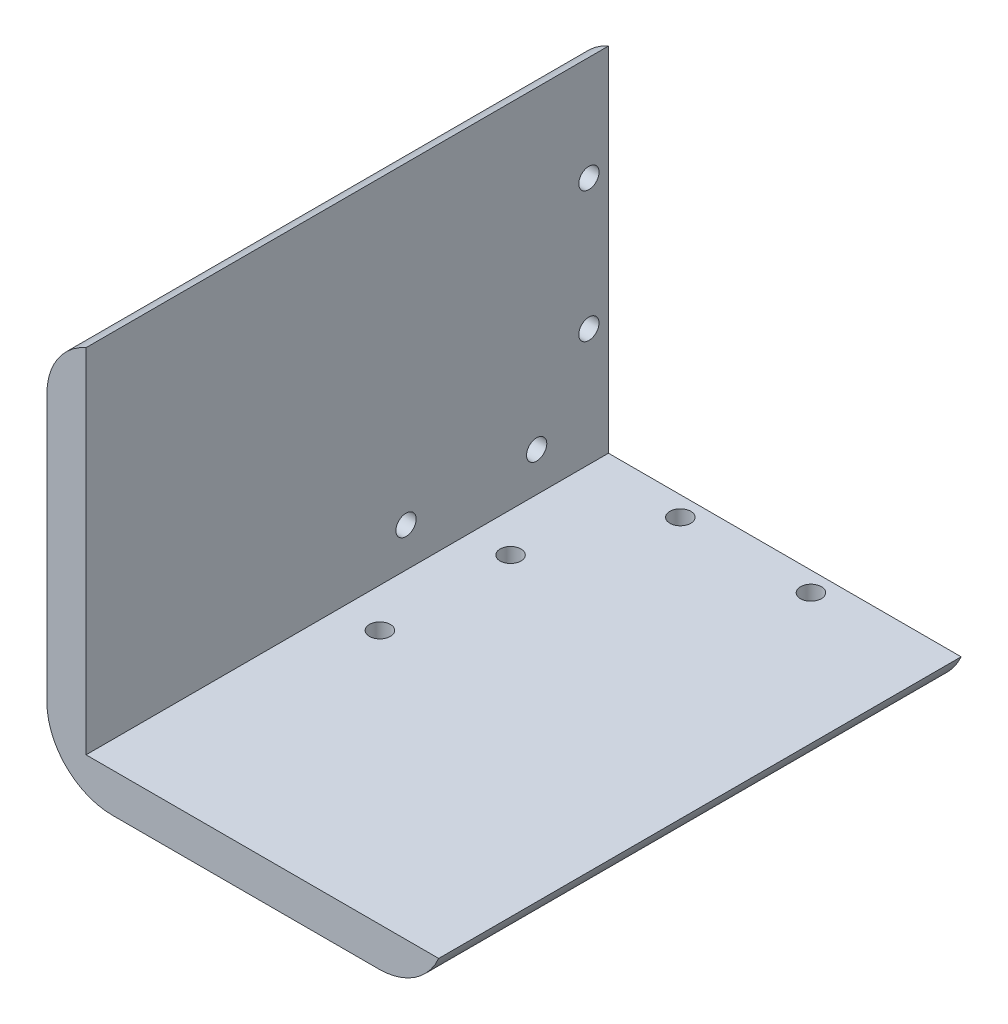
ISO-10303-21;
HEADER;
FILE_DESCRIPTION(('STEP AP214'),'2;1');
FILE_NAME('part.step','',(''),(''),'','','');
FILE_SCHEMA(('AUTOMOTIVE_DESIGN { 1 0 10303 214 1 1 1 1 }'));
ENDSEC;
DATA;
#1=APPLICATION_CONTEXT('core data for automotive mechanical design processes');
#2=APPLICATION_PROTOCOL_DEFINITION('international standard','automotive_design',2000,#1);
#3=PRODUCT_CONTEXT('',#1,'mechanical');
#4=PRODUCT('Part','Part','',(#3));
#5=PRODUCT_RELATED_PRODUCT_CATEGORY('part','',(#4));
#6=PRODUCT_DEFINITION_FORMATION('','',#4);
#7=PRODUCT_DEFINITION_CONTEXT('part definition',#1,'design');
#8=PRODUCT_DEFINITION('design','',#6,#7);
#9=PRODUCT_DEFINITION_SHAPE('','',#8);
#10=(LENGTH_UNIT() NAMED_UNIT(*) SI_UNIT(.MILLI.,.METRE.));
#11=(NAMED_UNIT(*) PLANE_ANGLE_UNIT() SI_UNIT($,.RADIAN.));
#12=(NAMED_UNIT(*) SI_UNIT($,.STERADIAN.) SOLID_ANGLE_UNIT());
#13=UNCERTAINTY_MEASURE_WITH_UNIT(LENGTH_MEASURE(1.E-05),#10,'distance_accuracy_value','');
#14=(GEOMETRIC_REPRESENTATION_CONTEXT(3) GLOBAL_UNCERTAINTY_ASSIGNED_CONTEXT((#13)) GLOBAL_UNIT_ASSIGNED_CONTEXT((#10,
#11,#12)) REPRESENTATION_CONTEXT('',''));
#15=CARTESIAN_POINT('',(0.,0.,0.));
#16=DIRECTION('',(0.,0.,1.));
#17=DIRECTION('',(1.,0.,0.));
#18=AXIS2_PLACEMENT_3D('',#15,#16,#17);
#19=CARTESIAN_POINT('',(60.,0.,40.));
#20=DIRECTION('',(0.,1.,0.));
#21=DIRECTION('',(-1.,0.,0.));
#22=AXIS2_PLACEMENT_3D('',#19,#20,#21);
#23=PLANE('',#22);
#24=CARTESIAN_POINT('',(20.,0.,-37.));
#25=DIRECTION('',(0.,-1.,0.));
#26=DIRECTION('',(1.,0.,0.));
#27=AXIS2_PLACEMENT_3D('',#24,#25,#26);
#28=CIRCLE('',#27,1.6);
#29=CARTESIAN_POINT('',(21.6,0.,-37.));
#30=VERTEX_POINT('',#29);
#31=EDGE_CURVE('E142',#30,#30,#28,.T.);
#32=ORIENTED_EDGE('',*,*,#31,.F.);
#33=EDGE_LOOP('',(#32));
#34=FACE_BOUND('',#33,.T.);
#35=CARTESIAN_POINT('',(40.,0.,-37.));
#36=DIRECTION('',(0.,-1.,0.));
#37=DIRECTION('',(1.,0.,0.));
#38=AXIS2_PLACEMENT_3D('',#35,#36,#37);
#39=CIRCLE('',#38,1.60000000000001);
#40=CARTESIAN_POINT('',(41.6,0.,-37.));
#41=VERTEX_POINT('',#40);
#42=EDGE_CURVE('E146',#41,#41,#39,.T.);
#43=ORIENTED_EDGE('',*,*,#42,.F.);
#44=EDGE_LOOP('',(#43));
#45=FACE_BOUND('',#44,.T.);
#46=CARTESIAN_POINT('',(12.0000000000001,0.,0.99999999999999));
#47=DIRECTION('',(0.,1.,0.));
#48=DIRECTION('',(0.,0.,1.));
#49=AXIS2_PLACEMENT_3D('',#46,#47,#48);
#50=CIRCLE('',#49,1.6);
#51=CARTESIAN_POINT('',(12.0000000000001,0.,2.59999999999999));
#52=VERTEX_POINT('',#51);
#53=EDGE_CURVE('E154',#52,#52,#50,.T.);
#54=ORIENTED_EDGE('',*,*,#53,.T.);
#55=EDGE_LOOP('',(#54));
#56=FACE_BOUND('',#55,.T.);
#57=CARTESIAN_POINT('',(12.0000000000001,0.,-19.));
#58=DIRECTION('',(0.,1.,0.));
#59=DIRECTION('',(0.,0.,1.));
#60=AXIS2_PLACEMENT_3D('',#57,#58,#59);
#61=CIRCLE('',#60,1.6);
#62=CARTESIAN_POINT('',(12.0000000000001,0.,-17.4));
#63=VERTEX_POINT('',#62);
#64=EDGE_CURVE('E148',#63,#63,#61,.T.);
#65=ORIENTED_EDGE('',*,*,#64,.T.);
#66=EDGE_LOOP('',(#65));
#67=FACE_BOUND('',#66,.T.);
#68=DIRECTION('',(1.,0.,0.));
#69=VECTOR('',#68,1.);
#70=CARTESIAN_POINT('',(60.,0.,-40.));
#71=LINE('',#70,#69);
#72=CARTESIAN_POINT('',(10.,0.,-40.));
#73=VERTEX_POINT('',#72);
#74=CARTESIAN_POINT('',(50.8348486100883,0.,-40.));
#75=VERTEX_POINT('',#74);
#76=EDGE_CURVE('E186',#73,#75,#71,.T.);
#77=ORIENTED_EDGE('',*,*,#76,.T.);
#78=DIRECTION('',(0.,0.,1.));
#79=VECTOR('',#78,1.);
#80=CARTESIAN_POINT('',(50.8348486100883,0.,40.));
#81=LINE('',#80,#79);
#82=CARTESIAN_POINT('',(50.8348486100883,0.,40.));
#83=VERTEX_POINT('',#82);
#84=EDGE_CURVE('E11',#75,#83,#81,.T.);
#85=ORIENTED_EDGE('',*,*,#84,.T.);
#86=DIRECTION('',(1.,0.,0.));
#87=VECTOR('',#86,1.);
#88=CARTESIAN_POINT('',(60.,0.,40.));
#89=LINE('',#88,#87);
#90=CARTESIAN_POINT('',(10.,0.,40.));
#91=VERTEX_POINT('',#90);
#92=EDGE_CURVE('E104',#91,#83,#89,.T.);
#93=ORIENTED_EDGE('',*,*,#92,.F.);
#94=DIRECTION('',(0.,0.,-1.));
#95=VECTOR('',#94,1.);
#96=CARTESIAN_POINT('',(10.,0.,40.));
#97=LINE('',#96,#95);
#98=EDGE_CURVE('E49',#91,#73,#97,.T.);
#99=ORIENTED_EDGE('',*,*,#98,.T.);
#100=EDGE_LOOP('',(#77,#85,#93,#99));
#101=FACE_BOUND('',#100,.T.);
#102=ADVANCED_FACE('F41',(#34,#45,#56,#67,#101),#23,.F.);
#103=CARTESIAN_POINT('',(6.00000000000001,6.,40.));
#104=DIRECTION('',(0.,-1.,0.));
#105=DIRECTION('',(0.,0.,-1.));
#106=AXIS2_PLACEMENT_3D('',#103,#104,#105);
#107=PLANE('',#106);
#108=CARTESIAN_POINT('',(20.,6.,-37.));
#109=DIRECTION('',(0.,-1.,0.));
#110=DIRECTION('',(0.,0.,-1.));
#111=AXIS2_PLACEMENT_3D('',#108,#109,#110);
#112=CIRCLE('',#111,1.6);
#113=CARTESIAN_POINT('',(20.,6.,-38.6));
#114=VERTEX_POINT('',#113);
#115=EDGE_CURVE('E44',#114,#114,#112,.T.);
#116=ORIENTED_EDGE('',*,*,#115,.T.);
#117=EDGE_LOOP('',(#116));
#118=FACE_BOUND('',#117,.T.);
#119=CARTESIAN_POINT('',(40.,6.,-37.));
#120=DIRECTION('',(0.,-1.,0.));
#121=DIRECTION('',(0.,0.,-1.));
#122=AXIS2_PLACEMENT_3D('',#119,#120,#121);
#123=CIRCLE('',#122,1.60000000000001);
#124=CARTESIAN_POINT('',(40.,6.,-38.6));
#125=VERTEX_POINT('',#124);
#126=EDGE_CURVE('E138',#125,#125,#123,.T.);
#127=ORIENTED_EDGE('',*,*,#126,.T.);
#128=EDGE_LOOP('',(#127));
#129=FACE_BOUND('',#128,.T.);
#130=CARTESIAN_POINT('',(12.0000000000001,6.,0.99999999999999));
#131=DIRECTION('',(0.,1.,0.));
#132=DIRECTION('',(0.,0.,1.));
#133=AXIS2_PLACEMENT_3D('',#130,#131,#132);
#134=CIRCLE('',#133,1.6);
#135=CARTESIAN_POINT('',(12.0000000000001,6.,2.59999999999999));
#136=VERTEX_POINT('',#135);
#137=EDGE_CURVE('E157',#136,#136,#134,.T.);
#138=ORIENTED_EDGE('',*,*,#137,.F.);
#139=EDGE_LOOP('',(#138));
#140=FACE_BOUND('',#139,.T.);
#141=CARTESIAN_POINT('',(12.0000000000001,6.,-19.));
#142=DIRECTION('',(0.,1.,0.));
#143=DIRECTION('',(0.,0.,1.));
#144=AXIS2_PLACEMENT_3D('',#141,#142,#143);
#145=CIRCLE('',#144,1.6);
#146=CARTESIAN_POINT('',(12.0000000000001,6.,-17.4));
#147=VERTEX_POINT('',#146);
#148=EDGE_CURVE('E165',#147,#147,#145,.T.);
#149=ORIENTED_EDGE('',*,*,#148,.F.);
#150=EDGE_LOOP('',(#149));
#151=FACE_BOUND('',#150,.T.);
#152=DIRECTION('',(-1.,0.,0.));
#153=VECTOR('',#152,1.);
#154=CARTESIAN_POINT('',(6.00000000000001,6.,-40.));
#155=LINE('',#154,#153);
#156=CARTESIAN_POINT('',(60.,6.,-40.));
#157=VERTEX_POINT('',#156);
#158=CARTESIAN_POINT('',(6.00000000000001,6.,-40.));
#159=VERTEX_POINT('',#158);
#160=EDGE_CURVE('E197',#157,#159,#155,.T.);
#161=ORIENTED_EDGE('',*,*,#160,.T.);
#162=DIRECTION('',(0.,0.,-1.));
#163=VECTOR('',#162,1.);
#164=CARTESIAN_POINT('',(6.00000000000001,6.,40.));
#165=LINE('',#164,#163);
#166=CARTESIAN_POINT('',(6.00000000000001,6.,40.));
#167=VERTEX_POINT('',#166);
#168=EDGE_CURVE('E117',#167,#159,#165,.T.);
#169=ORIENTED_EDGE('',*,*,#168,.F.);
#170=DIRECTION('',(-1.,0.,0.));
#171=VECTOR('',#170,1.);
#172=CARTESIAN_POINT('',(6.00000000000001,6.,40.));
#173=LINE('',#172,#171);
#174=CARTESIAN_POINT('',(60.,6.,40.));
#175=VERTEX_POINT('',#174);
#176=EDGE_CURVE('E103',#175,#167,#173,.T.);
#177=ORIENTED_EDGE('',*,*,#176,.F.);
#178=DIRECTION('',(0.,0.,-1.));
#179=VECTOR('',#178,1.);
#180=CARTESIAN_POINT('',(60.,6.,40.));
#181=LINE('',#180,#179);
#182=EDGE_CURVE('E114',#175,#157,#181,.T.);
#183=ORIENTED_EDGE('',*,*,#182,.T.);
#184=EDGE_LOOP('',(#161,#169,#177,#183));
#185=FACE_BOUND('',#184,.T.);
#186=ADVANCED_FACE('F115',(#118,#129,#140,#151,#185),#107,.F.);
#187=CARTESIAN_POINT('',(6.,60.,40.));
#188=DIRECTION('',(-1.,0.,0.));
#189=DIRECTION('',(0.,-1.,0.));
#190=AXIS2_PLACEMENT_3D('',#187,#188,#189);
#191=PLANE('',#190);
#192=CARTESIAN_POINT('',(6.00000000000001,11.9999999999996,-9.00000000000001));
#193=DIRECTION('',(-1.,0.,0.));
#194=DIRECTION('',(0.,-1.,0.));
#195=AXIS2_PLACEMENT_3D('',#192,#193,#194);
#196=CIRCLE('',#195,1.55);
#197=CARTESIAN_POINT('',(6.00000000000001,11.9999999999996,-7.45000000000001));
#198=VERTEX_POINT('',#197);
#199=EDGE_CURVE('E190',#198,#198,#196,.T.);
#200=ORIENTED_EDGE('',*,*,#199,.T.);
#201=EDGE_LOOP('',(#200));
#202=FACE_BOUND('',#201,.T.);
#203=CARTESIAN_POINT('',(6.00000000000001,11.9999999999996,-29.));
#204=DIRECTION('',(-1.,0.,0.));
#205=DIRECTION('',(0.,-1.,0.));
#206=AXIS2_PLACEMENT_3D('',#203,#204,#205);
#207=CIRCLE('',#206,1.55);
#208=CARTESIAN_POINT('',(6.00000000000001,11.9999999999996,-27.45));
#209=VERTEX_POINT('',#208);
#210=EDGE_CURVE('E184',#209,#209,#207,.T.);
#211=ORIENTED_EDGE('',*,*,#210,.T.);
#212=EDGE_LOOP('',(#211));
#213=FACE_BOUND('',#212,.T.);
#214=CARTESIAN_POINT('',(6.,43.9999999999997,-37.));
#215=DIRECTION('',(-1.,0.,0.));
#216=DIRECTION('',(0.,-1.,0.));
#217=AXIS2_PLACEMENT_3D('',#214,#215,#216);
#218=CIRCLE('',#217,1.55);
#219=CARTESIAN_POINT('',(6.00000000000001,43.9999999999997,-35.45));
#220=VERTEX_POINT('',#219);
#221=EDGE_CURVE('E182',#220,#220,#218,.T.);
#222=ORIENTED_EDGE('',*,*,#221,.T.);
#223=EDGE_LOOP('',(#222));
#224=FACE_BOUND('',#223,.T.);
#225=CARTESIAN_POINT('',(6.00000000000001,23.9999999999997,-37.));
#226=DIRECTION('',(-1.,0.,0.));
#227=DIRECTION('',(0.,-1.,0.));
#228=AXIS2_PLACEMENT_3D('',#225,#226,#227);
#229=CIRCLE('',#228,1.55);
#230=CARTESIAN_POINT('',(6.00000000000001,23.9999999999997,-35.45));
#231=VERTEX_POINT('',#230);
#232=EDGE_CURVE('E179',#231,#231,#229,.T.);
#233=ORIENTED_EDGE('',*,*,#232,.T.);
#234=EDGE_LOOP('',(#233));
#235=FACE_BOUND('',#234,.T.);
#236=DIRECTION('',(0.,1.,0.));
#237=VECTOR('',#236,1.);
#238=CARTESIAN_POINT('',(6.,60.,-40.));
#239=LINE('',#238,#237);
#240=CARTESIAN_POINT('',(6.,60.,-40.));
#241=VERTEX_POINT('',#240);
#242=EDGE_CURVE('E200',#159,#241,#239,.T.);
#243=ORIENTED_EDGE('',*,*,#242,.T.);
#244=DIRECTION('',(0.,0.,-1.));
#245=VECTOR('',#244,1.);
#246=CARTESIAN_POINT('',(6.,60.,40.));
#247=LINE('',#246,#245);
#248=CARTESIAN_POINT('',(6.,60.,40.));
#249=VERTEX_POINT('',#248);
#250=EDGE_CURVE('E127',#249,#241,#247,.T.);
#251=ORIENTED_EDGE('',*,*,#250,.F.);
#252=DIRECTION('',(0.,1.,0.));
#253=VECTOR('',#252,1.);
#254=CARTESIAN_POINT('',(6.,60.,40.));
#255=LINE('',#254,#253);
#256=EDGE_CURVE('E118',#167,#249,#255,.T.);
#257=ORIENTED_EDGE('',*,*,#256,.F.);
#258=ORIENTED_EDGE('',*,*,#168,.T.);
#259=EDGE_LOOP('',(#243,#251,#257,#258));
#260=FACE_BOUND('',#259,.T.);
#261=ADVANCED_FACE('F209',(#202,#213,#224,#235,#260),#191,.F.);
#262=CARTESIAN_POINT('',(0.,0.,40.));
#263=DIRECTION('',(1.,0.,0.));
#264=DIRECTION('',(0.,0.,-1.));
#265=AXIS2_PLACEMENT_3D('',#262,#263,#264);
#266=PLANE('',#265);
#267=CARTESIAN_POINT('',(0.,11.9999999999996,-9.00000000000001));
#268=DIRECTION('',(-1.,0.,0.));
#269=DIRECTION('',(0.,0.,1.));
#270=AXIS2_PLACEMENT_3D('',#267,#268,#269);
#271=CIRCLE('',#270,1.55);
#272=CARTESIAN_POINT('',(0.,11.9999999999996,-7.45000000000001));
#273=VERTEX_POINT('',#272);
#274=EDGE_CURVE('E158',#273,#273,#271,.T.);
#275=ORIENTED_EDGE('',*,*,#274,.F.);
#276=EDGE_LOOP('',(#275));
#277=FACE_BOUND('',#276,.T.);
#278=CARTESIAN_POINT('',(0.,11.9999999999996,-29.));
#279=DIRECTION('',(-1.,0.,0.));
#280=DIRECTION('',(0.,0.,1.));
#281=AXIS2_PLACEMENT_3D('',#278,#279,#280);
#282=CIRCLE('',#281,1.55);
#283=CARTESIAN_POINT('',(0.,11.9999999999996,-27.45));
#284=VERTEX_POINT('',#283);
#285=EDGE_CURVE('E172',#284,#284,#282,.T.);
#286=ORIENTED_EDGE('',*,*,#285,.F.);
#287=EDGE_LOOP('',(#286));
#288=FACE_BOUND('',#287,.T.);
#289=CARTESIAN_POINT('',(0.,43.9999999999997,-37.));
#290=DIRECTION('',(-1.,0.,0.));
#291=DIRECTION('',(0.,0.,1.));
#292=AXIS2_PLACEMENT_3D('',#289,#290,#291);
#293=CIRCLE('',#292,1.55);
#294=CARTESIAN_POINT('',(0.,43.9999999999997,-35.45));
#295=VERTEX_POINT('',#294);
#296=EDGE_CURVE('E170',#295,#295,#293,.T.);
#297=ORIENTED_EDGE('',*,*,#296,.F.);
#298=EDGE_LOOP('',(#297));
#299=FACE_BOUND('',#298,.T.);
#300=CARTESIAN_POINT('',(0.,23.9999999999997,-37.));
#301=DIRECTION('',(-1.,0.,0.));
#302=DIRECTION('',(0.,0.,1.));
#303=AXIS2_PLACEMENT_3D('',#300,#301,#302);
#304=CIRCLE('',#303,1.55);
#305=CARTESIAN_POINT('',(0.,23.9999999999997,-35.45));
#306=VERTEX_POINT('',#305);
#307=EDGE_CURVE('E168',#306,#306,#304,.T.);
#308=ORIENTED_EDGE('',*,*,#307,.F.);
#309=EDGE_LOOP('',(#308));
#310=FACE_BOUND('',#309,.T.);
#311=DIRECTION('',(0.,-1.,0.));
#312=VECTOR('',#311,1.);
#313=CARTESIAN_POINT('',(0.,0.,40.));
#314=LINE('',#313,#312);
#315=CARTESIAN_POINT('',(0.,50.8348486100883,40.));
#316=VERTEX_POINT('',#315);
#317=CARTESIAN_POINT('',(0.,10.,40.));
#318=VERTEX_POINT('',#317);
#319=EDGE_CURVE('E191',#316,#318,#314,.T.);
#320=ORIENTED_EDGE('',*,*,#319,.F.);
#321=DIRECTION('',(0.,0.,-1.));
#322=VECTOR('',#321,1.);
#323=CARTESIAN_POINT('',(0.,50.8348486100883,40.));
#324=LINE('',#323,#322);
#325=CARTESIAN_POINT('',(0.,50.8348486100883,-40.));
#326=VERTEX_POINT('',#325);
#327=EDGE_CURVE('E121',#316,#326,#324,.T.);
#328=ORIENTED_EDGE('',*,*,#327,.T.);
#329=DIRECTION('',(0.,-1.,0.));
#330=VECTOR('',#329,1.);
#331=CARTESIAN_POINT('',(0.,0.,-40.));
#332=LINE('',#331,#330);
#333=CARTESIAN_POINT('',(0.,10.,-40.));
#334=VERTEX_POINT('',#333);
#335=EDGE_CURVE('E192',#326,#334,#332,.T.);
#336=ORIENTED_EDGE('',*,*,#335,.T.);
#337=DIRECTION('',(0.,0.,-1.));
#338=VECTOR('',#337,1.);
#339=CARTESIAN_POINT('',(0.,10.,40.));
#340=LINE('',#339,#338);
#341=EDGE_CURVE('E125',#334,#318,#340,.F.);
#342=ORIENTED_EDGE('',*,*,#341,.T.);
#343=EDGE_LOOP('',(#320,#328,#336,#342));
#344=FACE_BOUND('',#343,.T.);
#345=ADVANCED_FACE('F218',(#277,#288,#299,#310,#344),#266,.F.);
#346=CARTESIAN_POINT('',(0.,0.,40.));
#347=DIRECTION('',(0.,0.,-1.));
#348=DIRECTION('',(-1.,0.,0.));
#349=AXIS2_PLACEMENT_3D('',#346,#347,#348);
#350=PLANE('',#349);
#351=ORIENTED_EDGE('',*,*,#256,.T.);
#352=CARTESIAN_POINT('',(10.,50.8348486100883,40.));
#353=DIRECTION('',(0.,0.,-1.));
#354=DIRECTION('',(-1.,0.,0.));
#355=AXIS2_PLACEMENT_3D('',#352,#353,#354);
#356=CIRCLE('',#355,10.);
#357=EDGE_CURVE('E107',#249,#316,#356,.F.);
#358=ORIENTED_EDGE('',*,*,#357,.T.);
#359=ORIENTED_EDGE('',*,*,#319,.T.);
#360=CARTESIAN_POINT('',(10.,10.,40.));
#361=DIRECTION('',(0.,0.,-1.));
#362=DIRECTION('',(-1.,0.,0.));
#363=AXIS2_PLACEMENT_3D('',#360,#361,#362);
#364=CIRCLE('',#363,10.);
#365=EDGE_CURVE('E63',#318,#91,#364,.F.);
#366=ORIENTED_EDGE('',*,*,#365,.T.);
#367=ORIENTED_EDGE('',*,*,#92,.T.);
#368=CARTESIAN_POINT('',(50.8348486100883,10.,40.));
#369=DIRECTION('',(0.,0.,-1.));
#370=DIRECTION('',(-1.,0.,0.));
#371=AXIS2_PLACEMENT_3D('',#368,#369,#370);
#372=CIRCLE('',#371,10.);
#373=EDGE_CURVE('E99',#83,#175,#372,.F.);
#374=ORIENTED_EDGE('',*,*,#373,.T.);
#375=ORIENTED_EDGE('',*,*,#176,.T.);
#376=EDGE_LOOP('',(#351,#358,#359,#366,#367,#374,#375));
#377=FACE_BOUND('',#376,.T.);
#378=ADVANCED_FACE('F105',(#377),#350,.F.);
#379=CARTESIAN_POINT('',(0.,0.,-40.));
#380=DIRECTION('',(0.,0.,-1.));
#381=DIRECTION('',(-1.,0.,0.));
#382=AXIS2_PLACEMENT_3D('',#379,#380,#381);
#383=PLANE('',#382);
#384=ORIENTED_EDGE('',*,*,#335,.F.);
#385=CARTESIAN_POINT('',(10.,50.8348486100883,-40.));
#386=DIRECTION('',(0.,0.,-1.));
#387=DIRECTION('',(-1.,0.,0.));
#388=AXIS2_PLACEMENT_3D('',#385,#386,#387);
#389=CIRCLE('',#388,10.);
#390=EDGE_CURVE('E131',#326,#241,#389,.T.);
#391=ORIENTED_EDGE('',*,*,#390,.T.);
#392=ORIENTED_EDGE('',*,*,#242,.F.);
#393=ORIENTED_EDGE('',*,*,#160,.F.);
#394=CARTESIAN_POINT('',(50.8348486100883,10.,-40.));
#395=DIRECTION('',(0.,0.,-1.));
#396=DIRECTION('',(-1.,0.,0.));
#397=AXIS2_PLACEMENT_3D('',#394,#395,#396);
#398=CIRCLE('',#397,10.);
#399=EDGE_CURVE('E122',#157,#75,#398,.T.);
#400=ORIENTED_EDGE('',*,*,#399,.T.);
#401=ORIENTED_EDGE('',*,*,#76,.F.);
#402=CARTESIAN_POINT('',(10.,10.,-40.));
#403=DIRECTION('',(0.,0.,-1.));
#404=DIRECTION('',(-1.,0.,0.));
#405=AXIS2_PLACEMENT_3D('',#402,#403,#404);
#406=CIRCLE('',#405,10.);
#407=EDGE_CURVE('E135',#73,#334,#406,.T.);
#408=ORIENTED_EDGE('',*,*,#407,.T.);
#409=EDGE_LOOP('',(#384,#391,#392,#393,#400,#401,#408));
#410=FACE_BOUND('',#409,.T.);
#411=ADVANCED_FACE('F212',(#410),#383,.T.);
#412=CARTESIAN_POINT('',(10.,50.8348486100883,40.));
#413=DIRECTION('',(0.,0.,-1.));
#414=DIRECTION('',(-1.,0.,0.));
#415=AXIS2_PLACEMENT_3D('',#412,#413,#414);
#416=CYLINDRICAL_SURFACE('',#415,10.);
#417=ORIENTED_EDGE('',*,*,#357,.F.);
#418=ORIENTED_EDGE('',*,*,#250,.T.);
#419=ORIENTED_EDGE('',*,*,#390,.F.);
#420=ORIENTED_EDGE('',*,*,#327,.F.);
#421=EDGE_LOOP('',(#417,#418,#419,#420));
#422=FACE_BOUND('',#421,.T.);
#423=ADVANCED_FACE('F210',(#422),#416,.T.);
#424=CARTESIAN_POINT('',(50.8348486100883,10.,40.));
#425=DIRECTION('',(0.,0.,1.));
#426=DIRECTION('',(1.,0.,0.));
#427=AXIS2_PLACEMENT_3D('',#424,#425,#426);
#428=CYLINDRICAL_SURFACE('',#427,10.);
#429=ORIENTED_EDGE('',*,*,#373,.F.);
#430=ORIENTED_EDGE('',*,*,#84,.F.);
#431=ORIENTED_EDGE('',*,*,#399,.F.);
#432=ORIENTED_EDGE('',*,*,#182,.F.);
#433=EDGE_LOOP('',(#429,#430,#431,#432));
#434=FACE_BOUND('',#433,.T.);
#435=ADVANCED_FACE('F116',(#434),#428,.T.);
#436=CARTESIAN_POINT('',(10.,10.,40.));
#437=DIRECTION('',(0.,0.,-1.));
#438=DIRECTION('',(-1.,0.,0.));
#439=AXIS2_PLACEMENT_3D('',#436,#437,#438);
#440=CYLINDRICAL_SURFACE('',#439,10.);
#441=ORIENTED_EDGE('',*,*,#365,.F.);
#442=ORIENTED_EDGE('',*,*,#341,.F.);
#443=ORIENTED_EDGE('',*,*,#407,.F.);
#444=ORIENTED_EDGE('',*,*,#98,.F.);
#445=EDGE_LOOP('',(#441,#442,#443,#444));
#446=FACE_BOUND('',#445,.T.);
#447=ADVANCED_FACE('F43',(#446),#440,.T.);
#448=CARTESIAN_POINT('',(60.,23.9999999999997,-37.));
#449=DIRECTION('',(-1.,0.,0.));
#450=DIRECTION('',(0.,0.,1.));
#451=AXIS2_PLACEMENT_3D('',#448,#449,#450);
#452=CYLINDRICAL_SURFACE('',#451,1.55);
#453=CARTESIAN_POINT('',(0.,23.9999999999997,-35.45));
#454=CARTESIAN_POINT('',(0.0625000000000001,23.9999999999997,-35.45));
#455=CARTESIAN_POINT('',(0.125,23.9999999999997,-35.45));
#456=CARTESIAN_POINT('',(0.25,23.9999999999997,-35.45));
#457=CARTESIAN_POINT('',(0.3125,23.9999999999997,-35.45));
#458=CARTESIAN_POINT('',(0.4375,23.9999999999997,-35.45));
#459=CARTESIAN_POINT('',(0.5,23.9999999999997,-35.45));
#460=CARTESIAN_POINT('',(0.625000000000001,23.9999999999997,-35.45));
#461=CARTESIAN_POINT('',(0.687500000000001,23.9999999999997,-35.45));
#462=CARTESIAN_POINT('',(0.812500000000001,23.9999999999997,-35.45));
#463=CARTESIAN_POINT('',(0.875000000000001,23.9999999999997,-35.45));
#464=CARTESIAN_POINT('',(1.,23.9999999999997,-35.45));
#465=CARTESIAN_POINT('',(1.0625,23.9999999999997,-35.45));
#466=CARTESIAN_POINT('',(1.1875,23.9999999999997,-35.45));
#467=CARTESIAN_POINT('',(1.25,23.9999999999997,-35.45));
#468=CARTESIAN_POINT('',(1.375,23.9999999999997,-35.45));
#469=CARTESIAN_POINT('',(1.4375,23.9999999999997,-35.45));
#470=CARTESIAN_POINT('',(1.5625,23.9999999999997,-35.45));
#471=CARTESIAN_POINT('',(1.625,23.9999999999997,-35.45));
#472=CARTESIAN_POINT('',(1.75,23.9999999999997,-35.45));
#473=CARTESIAN_POINT('',(1.8125,23.9999999999997,-35.45));
#474=CARTESIAN_POINT('',(1.9375,23.9999999999997,-35.45));
#475=CARTESIAN_POINT('',(2.,23.9999999999997,-35.45));
#476=CARTESIAN_POINT('',(2.125,23.9999999999997,-35.45));
#477=CARTESIAN_POINT('',(2.1875,23.9999999999997,-35.45));
#478=CARTESIAN_POINT('',(2.3125,23.9999999999997,-35.45));
#479=CARTESIAN_POINT('',(2.375,23.9999999999997,-35.45));
#480=CARTESIAN_POINT('',(2.5,23.9999999999997,-35.45));
#481=CARTESIAN_POINT('',(2.5625,23.9999999999997,-35.45));
#482=CARTESIAN_POINT('',(2.6875,23.9999999999997,-35.45));
#483=CARTESIAN_POINT('',(2.75,23.9999999999997,-35.45));
#484=CARTESIAN_POINT('',(2.875,23.9999999999997,-35.45));
#485=CARTESIAN_POINT('',(2.9375,23.9999999999997,-35.45));
#486=CARTESIAN_POINT('',(3.0625,23.9999999999997,-35.45));
#487=CARTESIAN_POINT('',(3.125,23.9999999999997,-35.45));
#488=CARTESIAN_POINT('',(3.25,23.9999999999997,-35.45));
#489=CARTESIAN_POINT('',(3.3125,23.9999999999997,-35.45));
#490=CARTESIAN_POINT('',(3.4375,23.9999999999997,-35.45));
#491=CARTESIAN_POINT('',(3.5,23.9999999999997,-35.45));
#492=CARTESIAN_POINT('',(3.625,23.9999999999997,-35.45));
#493=CARTESIAN_POINT('',(3.6875,23.9999999999997,-35.45));
#494=CARTESIAN_POINT('',(3.8125,23.9999999999997,-35.45));
#495=CARTESIAN_POINT('',(3.875,23.9999999999997,-35.45));
#496=CARTESIAN_POINT('',(4.,23.9999999999997,-35.45));
#497=CARTESIAN_POINT('',(4.0625,23.9999999999997,-35.45));
#498=CARTESIAN_POINT('',(4.1875,23.9999999999997,-35.45));
#499=CARTESIAN_POINT('',(4.25,23.9999999999997,-35.45));
#500=CARTESIAN_POINT('',(4.375,23.9999999999997,-35.45));
#501=CARTESIAN_POINT('',(4.4375,23.9999999999997,-35.45));
#502=CARTESIAN_POINT('',(4.5625,23.9999999999997,-35.45));
#503=CARTESIAN_POINT('',(4.625,23.9999999999997,-35.45));
#504=CARTESIAN_POINT('',(4.75,23.9999999999997,-35.45));
#505=CARTESIAN_POINT('',(4.8125,23.9999999999997,-35.45));
#506=CARTESIAN_POINT('',(4.9375,23.9999999999997,-35.45));
#507=CARTESIAN_POINT('',(5.,23.9999999999997,-35.45));
#508=CARTESIAN_POINT('',(5.125,23.9999999999997,-35.45));
#509=CARTESIAN_POINT('',(5.1875,23.9999999999997,-35.45));
#510=CARTESIAN_POINT('',(5.3125,23.9999999999997,-35.45));
#511=CARTESIAN_POINT('',(5.375,23.9999999999997,-35.45));
#512=CARTESIAN_POINT('',(5.50000000000001,23.9999999999997,-35.45));
#513=CARTESIAN_POINT('',(5.56250000000001,23.9999999999997,-35.45));
#514=CARTESIAN_POINT('',(5.68750000000001,23.9999999999997,-35.45));
#515=CARTESIAN_POINT('',(5.75000000000001,23.9999999999997,-35.45));
#516=CARTESIAN_POINT('',(5.87500000000001,23.9999999999997,-35.45));
#517=CARTESIAN_POINT('',(5.93750000000001,23.9999999999997,-35.45));
#518=CARTESIAN_POINT('',(6.00000000000001,23.9999999999997,-35.45));
#519=B_SPLINE_CURVE_WITH_KNOTS('',3,(#453,#454,#455,#456,#457,#458,#459,#460,#461,#462,#463,
#464,#465,#466,#467,#468,#469,#470,#471,#472,#473,#474,#475,#476,#477,#478,#479,#480,#481,#482,
#483,#484,#485,#486,#487,#488,#489,#490,#491,#492,#493,#494,#495,#496,#497,#498,#499,#500,#501,
#502,#503,#504,#505,#506,#507,#508,#509,#510,#511,#512,#513,#514,#515,#516,#517,#518),
.UNSPECIFIED.,.F.,.F.,(4,2,2,2,2,2,2,2,2,2,2,2,2,2,2,2,2,2,2,2,2,2,2,2,2,2,2,2,2,2,2,2,4),(0.,
0.1875,0.375,0.5625,0.750000000000001,0.937500000000001,1.125,1.3125,1.5,1.6875,1.875,2.0625,
2.25,2.4375,2.625,2.8125,3.,3.1875,3.375,3.5625,3.75,3.9375,4.125,4.3125,4.5,4.6875,4.875,
5.0625,5.25,5.4375,5.62500000000001,5.81250000000001,6.00000000000001),.UNSPECIFIED.);
#520=EDGE_CURVE('BSEAM239',#306,#231,#519,.T.);
#521=ORIENTED_EDGE('',*,*,#307,.T.);
#522=ORIENTED_EDGE('',*,*,#232,.F.);
#523=ORIENTED_EDGE('',*,*,#520,.T.);
#524=ORIENTED_EDGE('',*,*,#520,.F.);
#525=EDGE_LOOP('',(#521,#523,#522,#524));
#526=FACE_BOUND('',#525,.T.);
#527=ADVANCED_FACE('F239',(#526),#452,.F.);
#528=CARTESIAN_POINT('',(60.,43.9999999999997,-37.));
#529=DIRECTION('',(-1.,0.,0.));
#530=DIRECTION('',(0.,0.,1.));
#531=AXIS2_PLACEMENT_3D('',#528,#529,#530);
#532=CYLINDRICAL_SURFACE('',#531,1.55);
#533=CARTESIAN_POINT('',(0.,43.9999999999997,-35.45));
#534=CARTESIAN_POINT('',(0.0625000000000001,43.9999999999997,-35.45));
#535=CARTESIAN_POINT('',(0.125,43.9999999999997,-35.45));
#536=CARTESIAN_POINT('',(0.25,43.9999999999997,-35.45));
#537=CARTESIAN_POINT('',(0.3125,43.9999999999997,-35.45));
#538=CARTESIAN_POINT('',(0.4375,43.9999999999997,-35.45));
#539=CARTESIAN_POINT('',(0.5,43.9999999999997,-35.45));
#540=CARTESIAN_POINT('',(0.625000000000001,43.9999999999997,-35.45));
#541=CARTESIAN_POINT('',(0.687500000000001,43.9999999999997,-35.45));
#542=CARTESIAN_POINT('',(0.812500000000001,43.9999999999997,-35.45));
#543=CARTESIAN_POINT('',(0.875000000000001,43.9999999999997,-35.45));
#544=CARTESIAN_POINT('',(1.,43.9999999999997,-35.45));
#545=CARTESIAN_POINT('',(1.0625,43.9999999999997,-35.45));
#546=CARTESIAN_POINT('',(1.1875,43.9999999999997,-35.45));
#547=CARTESIAN_POINT('',(1.25,43.9999999999997,-35.45));
#548=CARTESIAN_POINT('',(1.375,43.9999999999997,-35.45));
#549=CARTESIAN_POINT('',(1.4375,43.9999999999997,-35.45));
#550=CARTESIAN_POINT('',(1.5625,43.9999999999997,-35.45));
#551=CARTESIAN_POINT('',(1.625,43.9999999999997,-35.45));
#552=CARTESIAN_POINT('',(1.75,43.9999999999997,-35.45));
#553=CARTESIAN_POINT('',(1.8125,43.9999999999997,-35.45));
#554=CARTESIAN_POINT('',(1.9375,43.9999999999997,-35.45));
#555=CARTESIAN_POINT('',(2.,43.9999999999997,-35.45));
#556=CARTESIAN_POINT('',(2.125,43.9999999999997,-35.45));
#557=CARTESIAN_POINT('',(2.1875,43.9999999999997,-35.45));
#558=CARTESIAN_POINT('',(2.3125,43.9999999999997,-35.45));
#559=CARTESIAN_POINT('',(2.375,43.9999999999997,-35.45));
#560=CARTESIAN_POINT('',(2.5,43.9999999999997,-35.45));
#561=CARTESIAN_POINT('',(2.5625,43.9999999999997,-35.45));
#562=CARTESIAN_POINT('',(2.6875,43.9999999999997,-35.45));
#563=CARTESIAN_POINT('',(2.75,43.9999999999997,-35.45));
#564=CARTESIAN_POINT('',(2.875,43.9999999999997,-35.45));
#565=CARTESIAN_POINT('',(2.9375,43.9999999999997,-35.45));
#566=CARTESIAN_POINT('',(3.0625,43.9999999999997,-35.45));
#567=CARTESIAN_POINT('',(3.125,43.9999999999997,-35.45));
#568=CARTESIAN_POINT('',(3.25,43.9999999999997,-35.45));
#569=CARTESIAN_POINT('',(3.3125,43.9999999999997,-35.45));
#570=CARTESIAN_POINT('',(3.4375,43.9999999999997,-35.45));
#571=CARTESIAN_POINT('',(3.5,43.9999999999997,-35.45));
#572=CARTESIAN_POINT('',(3.625,43.9999999999997,-35.45));
#573=CARTESIAN_POINT('',(3.6875,43.9999999999997,-35.45));
#574=CARTESIAN_POINT('',(3.8125,43.9999999999997,-35.45));
#575=CARTESIAN_POINT('',(3.875,43.9999999999997,-35.45));
#576=CARTESIAN_POINT('',(4.,43.9999999999997,-35.45));
#577=CARTESIAN_POINT('',(4.0625,43.9999999999997,-35.45));
#578=CARTESIAN_POINT('',(4.1875,43.9999999999997,-35.45));
#579=CARTESIAN_POINT('',(4.25,43.9999999999997,-35.45));
#580=CARTESIAN_POINT('',(4.375,43.9999999999997,-35.45));
#581=CARTESIAN_POINT('',(4.4375,43.9999999999997,-35.45));
#582=CARTESIAN_POINT('',(4.5625,43.9999999999997,-35.45));
#583=CARTESIAN_POINT('',(4.625,43.9999999999997,-35.45));
#584=CARTESIAN_POINT('',(4.75,43.9999999999997,-35.45));
#585=CARTESIAN_POINT('',(4.8125,43.9999999999997,-35.45));
#586=CARTESIAN_POINT('',(4.9375,43.9999999999997,-35.45));
#587=CARTESIAN_POINT('',(5.,43.9999999999997,-35.45));
#588=CARTESIAN_POINT('',(5.125,43.9999999999997,-35.45));
#589=CARTESIAN_POINT('',(5.1875,43.9999999999997,-35.45));
#590=CARTESIAN_POINT('',(5.3125,43.9999999999997,-35.45));
#591=CARTESIAN_POINT('',(5.375,43.9999999999997,-35.45));
#592=CARTESIAN_POINT('',(5.50000000000001,43.9999999999997,-35.45));
#593=CARTESIAN_POINT('',(5.56250000000001,43.9999999999997,-35.45));
#594=CARTESIAN_POINT('',(5.68750000000001,43.9999999999997,-35.45));
#595=CARTESIAN_POINT('',(5.75000000000001,43.9999999999997,-35.45));
#596=CARTESIAN_POINT('',(5.87500000000001,43.9999999999997,-35.45));
#597=CARTESIAN_POINT('',(5.93750000000001,43.9999999999997,-35.45));
#598=CARTESIAN_POINT('',(6.00000000000001,43.9999999999997,-35.45));
#599=B_SPLINE_CURVE_WITH_KNOTS('',3,(#533,#534,#535,#536,#537,#538,#539,#540,#541,#542,#543,
#544,#545,#546,#547,#548,#549,#550,#551,#552,#553,#554,#555,#556,#557,#558,#559,#560,#561,#562,
#563,#564,#565,#566,#567,#568,#569,#570,#571,#572,#573,#574,#575,#576,#577,#578,#579,#580,#581,
#582,#583,#584,#585,#586,#587,#588,#589,#590,#591,#592,#593,#594,#595,#596,#597,#598),
.UNSPECIFIED.,.F.,.F.,(4,2,2,2,2,2,2,2,2,2,2,2,2,2,2,2,2,2,2,2,2,2,2,2,2,2,2,2,2,2,2,2,4),(0.,
0.1875,0.375,0.5625,0.750000000000001,0.937500000000001,1.125,1.3125,1.5,1.6875,1.875,2.0625,
2.25,2.4375,2.625,2.8125,3.,3.1875,3.375,3.5625,3.75,3.9375,4.125,4.3125,4.5,4.6875,4.875,
5.0625,5.25,5.4375,5.62500000000001,5.81250000000001,6.00000000000001),.UNSPECIFIED.);
#600=EDGE_CURVE('BSEAM244',#295,#220,#599,.T.);
#601=ORIENTED_EDGE('',*,*,#296,.T.);
#602=ORIENTED_EDGE('',*,*,#221,.F.);
#603=ORIENTED_EDGE('',*,*,#600,.T.);
#604=ORIENTED_EDGE('',*,*,#600,.F.);
#605=EDGE_LOOP('',(#601,#603,#602,#604));
#606=FACE_BOUND('',#605,.T.);
#607=ADVANCED_FACE('F244',(#606),#532,.F.);
#608=CARTESIAN_POINT('',(60.,11.9999999999996,-29.));
#609=DIRECTION('',(-1.,0.,0.));
#610=DIRECTION('',(0.,0.,1.));
#611=AXIS2_PLACEMENT_3D('',#608,#609,#610);
#612=CYLINDRICAL_SURFACE('',#611,1.55);
#613=CARTESIAN_POINT('',(0.,11.9999999999996,-27.45));
#614=CARTESIAN_POINT('',(0.0625000000000001,11.9999999999996,-27.45));
#615=CARTESIAN_POINT('',(0.125,11.9999999999996,-27.45));
#616=CARTESIAN_POINT('',(0.25,11.9999999999996,-27.45));
#617=CARTESIAN_POINT('',(0.3125,11.9999999999996,-27.45));
#618=CARTESIAN_POINT('',(0.4375,11.9999999999996,-27.45));
#619=CARTESIAN_POINT('',(0.5,11.9999999999996,-27.45));
#620=CARTESIAN_POINT('',(0.625000000000001,11.9999999999996,-27.45));
#621=CARTESIAN_POINT('',(0.687500000000001,11.9999999999996,-27.45));
#622=CARTESIAN_POINT('',(0.812500000000001,11.9999999999996,-27.45));
#623=CARTESIAN_POINT('',(0.875000000000001,11.9999999999996,-27.45));
#624=CARTESIAN_POINT('',(1.,11.9999999999996,-27.45));
#625=CARTESIAN_POINT('',(1.0625,11.9999999999996,-27.45));
#626=CARTESIAN_POINT('',(1.1875,11.9999999999996,-27.45));
#627=CARTESIAN_POINT('',(1.25,11.9999999999996,-27.45));
#628=CARTESIAN_POINT('',(1.375,11.9999999999996,-27.45));
#629=CARTESIAN_POINT('',(1.4375,11.9999999999996,-27.45));
#630=CARTESIAN_POINT('',(1.5625,11.9999999999996,-27.45));
#631=CARTESIAN_POINT('',(1.625,11.9999999999996,-27.45));
#632=CARTESIAN_POINT('',(1.75,11.9999999999996,-27.45));
#633=CARTESIAN_POINT('',(1.8125,11.9999999999996,-27.45));
#634=CARTESIAN_POINT('',(1.9375,11.9999999999996,-27.45));
#635=CARTESIAN_POINT('',(2.,11.9999999999996,-27.45));
#636=CARTESIAN_POINT('',(2.125,11.9999999999996,-27.45));
#637=CARTESIAN_POINT('',(2.1875,11.9999999999996,-27.45));
#638=CARTESIAN_POINT('',(2.3125,11.9999999999996,-27.45));
#639=CARTESIAN_POINT('',(2.375,11.9999999999996,-27.45));
#640=CARTESIAN_POINT('',(2.5,11.9999999999996,-27.45));
#641=CARTESIAN_POINT('',(2.5625,11.9999999999996,-27.45));
#642=CARTESIAN_POINT('',(2.6875,11.9999999999996,-27.45));
#643=CARTESIAN_POINT('',(2.75,11.9999999999996,-27.45));
#644=CARTESIAN_POINT('',(2.875,11.9999999999996,-27.45));
#645=CARTESIAN_POINT('',(2.9375,11.9999999999996,-27.45));
#646=CARTESIAN_POINT('',(3.0625,11.9999999999996,-27.45));
#647=CARTESIAN_POINT('',(3.125,11.9999999999996,-27.45));
#648=CARTESIAN_POINT('',(3.25,11.9999999999996,-27.45));
#649=CARTESIAN_POINT('',(3.3125,11.9999999999996,-27.45));
#650=CARTESIAN_POINT('',(3.4375,11.9999999999996,-27.45));
#651=CARTESIAN_POINT('',(3.5,11.9999999999996,-27.45));
#652=CARTESIAN_POINT('',(3.625,11.9999999999996,-27.45));
#653=CARTESIAN_POINT('',(3.6875,11.9999999999996,-27.45));
#654=CARTESIAN_POINT('',(3.8125,11.9999999999996,-27.45));
#655=CARTESIAN_POINT('',(3.875,11.9999999999996,-27.45));
#656=CARTESIAN_POINT('',(4.,11.9999999999996,-27.45));
#657=CARTESIAN_POINT('',(4.0625,11.9999999999996,-27.45));
#658=CARTESIAN_POINT('',(4.1875,11.9999999999996,-27.45));
#659=CARTESIAN_POINT('',(4.25,11.9999999999996,-27.45));
#660=CARTESIAN_POINT('',(4.375,11.9999999999996,-27.45));
#661=CARTESIAN_POINT('',(4.4375,11.9999999999996,-27.45));
#662=CARTESIAN_POINT('',(4.5625,11.9999999999996,-27.45));
#663=CARTESIAN_POINT('',(4.625,11.9999999999996,-27.45));
#664=CARTESIAN_POINT('',(4.75,11.9999999999996,-27.45));
#665=CARTESIAN_POINT('',(4.8125,11.9999999999996,-27.45));
#666=CARTESIAN_POINT('',(4.9375,11.9999999999996,-27.45));
#667=CARTESIAN_POINT('',(5.,11.9999999999996,-27.45));
#668=CARTESIAN_POINT('',(5.125,11.9999999999996,-27.45));
#669=CARTESIAN_POINT('',(5.1875,11.9999999999996,-27.45));
#670=CARTESIAN_POINT('',(5.3125,11.9999999999996,-27.45));
#671=CARTESIAN_POINT('',(5.375,11.9999999999996,-27.45));
#672=CARTESIAN_POINT('',(5.50000000000001,11.9999999999996,-27.45));
#673=CARTESIAN_POINT('',(5.56250000000001,11.9999999999996,-27.45));
#674=CARTESIAN_POINT('',(5.68750000000001,11.9999999999996,-27.45));
#675=CARTESIAN_POINT('',(5.75000000000001,11.9999999999996,-27.45));
#676=CARTESIAN_POINT('',(5.87500000000001,11.9999999999996,-27.45));
#677=CARTESIAN_POINT('',(5.93750000000001,11.9999999999996,-27.45));
#678=CARTESIAN_POINT('',(6.00000000000001,11.9999999999996,-27.45));
#679=B_SPLINE_CURVE_WITH_KNOTS('',3,(#613,#614,#615,#616,#617,#618,#619,#620,#621,#622,#623,
#624,#625,#626,#627,#628,#629,#630,#631,#632,#633,#634,#635,#636,#637,#638,#639,#640,#641,#642,
#643,#644,#645,#646,#647,#648,#649,#650,#651,#652,#653,#654,#655,#656,#657,#658,#659,#660,#661,
#662,#663,#664,#665,#666,#667,#668,#669,#670,#671,#672,#673,#674,#675,#676,#677,#678),
.UNSPECIFIED.,.F.,.F.,(4,2,2,2,2,2,2,2,2,2,2,2,2,2,2,2,2,2,2,2,2,2,2,2,2,2,2,2,2,2,2,2,4),(0.,
0.1875,0.375,0.5625,0.750000000000001,0.937500000000001,1.125,1.3125,1.5,1.6875,1.875,2.0625,
2.25,2.4375,2.625,2.8125,3.,3.1875,3.375,3.5625,3.75,3.9375,4.125,4.3125,4.5,4.6875,4.875,
5.0625,5.25,5.4375,5.62500000000001,5.81250000000001,6.00000000000001),.UNSPECIFIED.);
#680=EDGE_CURVE('BSEAM253',#284,#209,#679,.T.);
#681=ORIENTED_EDGE('',*,*,#285,.T.);
#682=ORIENTED_EDGE('',*,*,#210,.F.);
#683=ORIENTED_EDGE('',*,*,#680,.T.);
#684=ORIENTED_EDGE('',*,*,#680,.F.);
#685=EDGE_LOOP('',(#681,#683,#682,#684));
#686=FACE_BOUND('',#685,.T.);
#687=ADVANCED_FACE('F253',(#686),#612,.F.);
#688=CARTESIAN_POINT('',(60.,11.9999999999996,-9.00000000000001));
#689=DIRECTION('',(-1.,0.,0.));
#690=DIRECTION('',(0.,0.,1.));
#691=AXIS2_PLACEMENT_3D('',#688,#689,#690);
#692=CYLINDRICAL_SURFACE('',#691,1.55);
#693=CARTESIAN_POINT('',(0.,11.9999999999996,-7.45000000000001));
#694=CARTESIAN_POINT('',(0.0625000000000001,11.9999999999996,-7.45000000000001));
#695=CARTESIAN_POINT('',(0.125,11.9999999999996,-7.45000000000001));
#696=CARTESIAN_POINT('',(0.25,11.9999999999996,-7.45000000000001));
#697=CARTESIAN_POINT('',(0.3125,11.9999999999996,-7.45000000000001));
#698=CARTESIAN_POINT('',(0.4375,11.9999999999996,-7.45000000000001));
#699=CARTESIAN_POINT('',(0.5,11.9999999999996,-7.45000000000001));
#700=CARTESIAN_POINT('',(0.625000000000001,11.9999999999996,-7.45000000000001));
#701=CARTESIAN_POINT('',(0.687500000000001,11.9999999999996,-7.45000000000001));
#702=CARTESIAN_POINT('',(0.812500000000001,11.9999999999996,-7.45000000000001));
#703=CARTESIAN_POINT('',(0.875000000000001,11.9999999999996,-7.45000000000001));
#704=CARTESIAN_POINT('',(1.,11.9999999999996,-7.45000000000001));
#705=CARTESIAN_POINT('',(1.0625,11.9999999999996,-7.45000000000001));
#706=CARTESIAN_POINT('',(1.1875,11.9999999999996,-7.45000000000001));
#707=CARTESIAN_POINT('',(1.25,11.9999999999996,-7.45000000000001));
#708=CARTESIAN_POINT('',(1.375,11.9999999999996,-7.45000000000001));
#709=CARTESIAN_POINT('',(1.4375,11.9999999999996,-7.45000000000001));
#710=CARTESIAN_POINT('',(1.5625,11.9999999999996,-7.45000000000001));
#711=CARTESIAN_POINT('',(1.625,11.9999999999996,-7.45000000000001));
#712=CARTESIAN_POINT('',(1.75,11.9999999999996,-7.45000000000001));
#713=CARTESIAN_POINT('',(1.8125,11.9999999999996,-7.45000000000001));
#714=CARTESIAN_POINT('',(1.9375,11.9999999999996,-7.45000000000001));
#715=CARTESIAN_POINT('',(2.,11.9999999999996,-7.45000000000001));
#716=CARTESIAN_POINT('',(2.125,11.9999999999996,-7.45000000000001));
#717=CARTESIAN_POINT('',(2.1875,11.9999999999996,-7.45000000000001));
#718=CARTESIAN_POINT('',(2.3125,11.9999999999996,-7.45000000000001));
#719=CARTESIAN_POINT('',(2.375,11.9999999999996,-7.45000000000001));
#720=CARTESIAN_POINT('',(2.5,11.9999999999996,-7.45000000000001));
#721=CARTESIAN_POINT('',(2.5625,11.9999999999996,-7.45000000000001));
#722=CARTESIAN_POINT('',(2.6875,11.9999999999996,-7.45000000000001));
#723=CARTESIAN_POINT('',(2.75,11.9999999999996,-7.45000000000001));
#724=CARTESIAN_POINT('',(2.875,11.9999999999996,-7.45000000000001));
#725=CARTESIAN_POINT('',(2.9375,11.9999999999996,-7.45000000000001));
#726=CARTESIAN_POINT('',(3.0625,11.9999999999996,-7.45000000000001));
#727=CARTESIAN_POINT('',(3.125,11.9999999999996,-7.45000000000001));
#728=CARTESIAN_POINT('',(3.25,11.9999999999996,-7.45000000000001));
#729=CARTESIAN_POINT('',(3.3125,11.9999999999996,-7.45000000000001));
#730=CARTESIAN_POINT('',(3.4375,11.9999999999996,-7.45000000000001));
#731=CARTESIAN_POINT('',(3.5,11.9999999999996,-7.45000000000001));
#732=CARTESIAN_POINT('',(3.625,11.9999999999996,-7.45000000000001));
#733=CARTESIAN_POINT('',(3.6875,11.9999999999996,-7.45000000000001));
#734=CARTESIAN_POINT('',(3.8125,11.9999999999996,-7.45000000000001));
#735=CARTESIAN_POINT('',(3.875,11.9999999999996,-7.45000000000001));
#736=CARTESIAN_POINT('',(4.,11.9999999999996,-7.45000000000001));
#737=CARTESIAN_POINT('',(4.0625,11.9999999999996,-7.45000000000001));
#738=CARTESIAN_POINT('',(4.1875,11.9999999999996,-7.45000000000001));
#739=CARTESIAN_POINT('',(4.25,11.9999999999996,-7.45000000000001));
#740=CARTESIAN_POINT('',(4.375,11.9999999999996,-7.45000000000001));
#741=CARTESIAN_POINT('',(4.4375,11.9999999999996,-7.45000000000001));
#742=CARTESIAN_POINT('',(4.5625,11.9999999999996,-7.45000000000001));
#743=CARTESIAN_POINT('',(4.625,11.9999999999996,-7.45000000000001));
#744=CARTESIAN_POINT('',(4.75,11.9999999999996,-7.45000000000001));
#745=CARTESIAN_POINT('',(4.8125,11.9999999999996,-7.45000000000001));
#746=CARTESIAN_POINT('',(4.9375,11.9999999999996,-7.45000000000001));
#747=CARTESIAN_POINT('',(5.,11.9999999999996,-7.45000000000001));
#748=CARTESIAN_POINT('',(5.125,11.9999999999996,-7.45000000000001));
#749=CARTESIAN_POINT('',(5.1875,11.9999999999996,-7.45000000000001));
#750=CARTESIAN_POINT('',(5.3125,11.9999999999996,-7.45000000000001));
#751=CARTESIAN_POINT('',(5.375,11.9999999999996,-7.45000000000001));
#752=CARTESIAN_POINT('',(5.50000000000001,11.9999999999996,-7.45000000000001));
#753=CARTESIAN_POINT('',(5.56250000000001,11.9999999999996,-7.45000000000001));
#754=CARTESIAN_POINT('',(5.68750000000001,11.9999999999996,-7.45000000000001));
#755=CARTESIAN_POINT('',(5.75000000000001,11.9999999999996,-7.45000000000001));
#756=CARTESIAN_POINT('',(5.87500000000001,11.9999999999996,-7.45000000000001));
#757=CARTESIAN_POINT('',(5.93750000000001,11.9999999999996,-7.45000000000001));
#758=CARTESIAN_POINT('',(6.00000000000001,11.9999999999996,-7.45000000000001));
#759=B_SPLINE_CURVE_WITH_KNOTS('',3,(#693,#694,#695,#696,#697,#698,#699,#700,#701,#702,#703,
#704,#705,#706,#707,#708,#709,#710,#711,#712,#713,#714,#715,#716,#717,#718,#719,#720,#721,#722,
#723,#724,#725,#726,#727,#728,#729,#730,#731,#732,#733,#734,#735,#736,#737,#738,#739,#740,#741,
#742,#743,#744,#745,#746,#747,#748,#749,#750,#751,#752,#753,#754,#755,#756,#757,#758),
.UNSPECIFIED.,.F.,.F.,(4,2,2,2,2,2,2,2,2,2,2,2,2,2,2,2,2,2,2,2,2,2,2,2,2,2,2,2,2,2,2,2,4),(0.,
0.1875,0.375,0.5625,0.750000000000001,0.937500000000001,1.125,1.3125,1.5,1.6875,1.875,2.0625,
2.25,2.4375,2.625,2.8125,3.,3.1875,3.375,3.5625,3.75,3.9375,4.125,4.3125,4.5,4.6875,4.875,
5.0625,5.25,5.4375,5.62500000000001,5.81250000000001,6.00000000000001),.UNSPECIFIED.);
#760=EDGE_CURVE('BSEAM260',#273,#198,#759,.T.);
#761=ORIENTED_EDGE('',*,*,#274,.T.);
#762=ORIENTED_EDGE('',*,*,#199,.F.);
#763=ORIENTED_EDGE('',*,*,#760,.T.);
#764=ORIENTED_EDGE('',*,*,#760,.F.);
#765=EDGE_LOOP('',(#761,#763,#762,#764));
#766=FACE_BOUND('',#765,.T.);
#767=ADVANCED_FACE('F260',(#766),#692,.F.);
#768=CARTESIAN_POINT('',(12.0000000000001,0.,-19.));
#769=DIRECTION('',(0.,1.,0.));
#770=DIRECTION('',(0.,0.,1.));
#771=AXIS2_PLACEMENT_3D('',#768,#769,#770);
#772=CYLINDRICAL_SURFACE('',#771,1.6);
#773=ORIENTED_EDGE('',*,*,#64,.F.);
#774=EDGE_LOOP('',(#773));
#775=FACE_BOUND('',#774,.T.);
#776=ORIENTED_EDGE('',*,*,#148,.T.);
#777=EDGE_LOOP('',(#776));
#778=FACE_BOUND('',#777,.T.);
#779=ADVANCED_FACE('F282',(#775,#778),#772,.F.);
#780=CARTESIAN_POINT('',(12.0000000000001,0.,0.99999999999999));
#781=DIRECTION('',(0.,1.,0.));
#782=DIRECTION('',(0.,0.,1.));
#783=AXIS2_PLACEMENT_3D('',#780,#781,#782);
#784=CYLINDRICAL_SURFACE('',#783,1.6);
#785=ORIENTED_EDGE('',*,*,#53,.F.);
#786=EDGE_LOOP('',(#785));
#787=FACE_BOUND('',#786,.T.);
#788=ORIENTED_EDGE('',*,*,#137,.T.);
#789=EDGE_LOOP('',(#788));
#790=FACE_BOUND('',#789,.T.);
#791=ADVANCED_FACE('F287',(#787,#790),#784,.F.);
#792=CARTESIAN_POINT('',(40.,60.,-37.));
#793=DIRECTION('',(0.,-1.,0.));
#794=DIRECTION('',(1.,0.,0.));
#795=AXIS2_PLACEMENT_3D('',#792,#793,#794);
#796=CYLINDRICAL_SURFACE('',#795,1.60000000000001);
#797=ORIENTED_EDGE('',*,*,#42,.T.);
#798=EDGE_LOOP('',(#797));
#799=FACE_BOUND('',#798,.T.);
#800=ORIENTED_EDGE('',*,*,#126,.F.);
#801=EDGE_LOOP('',(#800));
#802=FACE_BOUND('',#801,.T.);
#803=ADVANCED_FACE('F286',(#799,#802),#796,.F.);
#804=CARTESIAN_POINT('',(20.,60.,-37.));
#805=DIRECTION('',(0.,-1.,0.));
#806=DIRECTION('',(1.,0.,0.));
#807=AXIS2_PLACEMENT_3D('',#804,#805,#806);
#808=CYLINDRICAL_SURFACE('',#807,1.6);
#809=ORIENTED_EDGE('',*,*,#31,.T.);
#810=EDGE_LOOP('',(#809));
#811=FACE_BOUND('',#810,.T.);
#812=ORIENTED_EDGE('',*,*,#115,.F.);
#813=EDGE_LOOP('',(#812));
#814=FACE_BOUND('',#813,.T.);
#815=ADVANCED_FACE('F291',(#811,#814),#808,.F.);
#816=CLOSED_SHELL('',(#102,#186,#261,#345,#378,#411,#423,#435,#447,#527,#607,#687,#767,#779,
#791,#803,#815));
#817=MANIFOLD_SOLID_BREP('B2',#816);
#818=ADVANCED_BREP_SHAPE_REPRESENTATION('',(#18,#817),#14);
#819=SHAPE_DEFINITION_REPRESENTATION(#9,#818);
ENDSEC;
END-ISO-10303-21;
